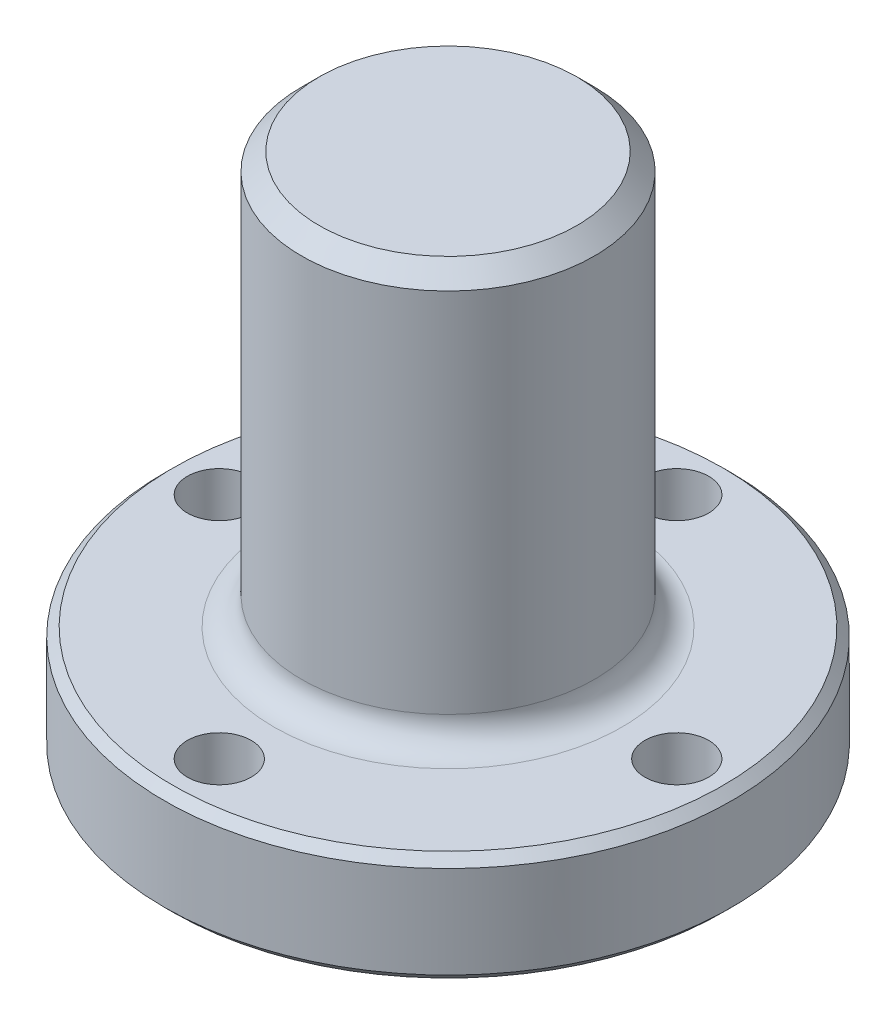
ISO-10303-21;
HEADER;
FILE_DESCRIPTION(('STEP AP214'),'2;1');
FILE_NAME('part.step','',(''),(''),'','','');
FILE_SCHEMA(('AUTOMOTIVE_DESIGN { 1 0 10303 214 1 1 1 1 }'));
ENDSEC;
DATA;
#1=APPLICATION_CONTEXT('core data for automotive mechanical design processes');
#2=APPLICATION_PROTOCOL_DEFINITION('international standard','automotive_design',2000,#1);
#3=PRODUCT_CONTEXT('',#1,'mechanical');
#4=PRODUCT('Part','Part','',(#3));
#5=PRODUCT_RELATED_PRODUCT_CATEGORY('part','',(#4));
#6=PRODUCT_DEFINITION_FORMATION('','',#4);
#7=PRODUCT_DEFINITION_CONTEXT('part definition',#1,'design');
#8=PRODUCT_DEFINITION('design','',#6,#7);
#9=PRODUCT_DEFINITION_SHAPE('','',#8);
#10=(LENGTH_UNIT() NAMED_UNIT(*) SI_UNIT(.MILLI.,.METRE.));
#11=(NAMED_UNIT(*) PLANE_ANGLE_UNIT() SI_UNIT($,.RADIAN.));
#12=(NAMED_UNIT(*) SI_UNIT($,.STERADIAN.) SOLID_ANGLE_UNIT());
#13=UNCERTAINTY_MEASURE_WITH_UNIT(LENGTH_MEASURE(1.E-05),#10,'distance_accuracy_value','');
#14=(GEOMETRIC_REPRESENTATION_CONTEXT(3) GLOBAL_UNCERTAINTY_ASSIGNED_CONTEXT((#13)) GLOBAL_UNIT_ASSIGNED_CONTEXT((#10,
#11,#12)) REPRESENTATION_CONTEXT('',''));
#15=CARTESIAN_POINT('',(0.,0.,0.));
#16=DIRECTION('',(0.,0.,1.));
#17=DIRECTION('',(1.,0.,0.));
#18=AXIS2_PLACEMENT_3D('',#15,#16,#17);
#19=CARTESIAN_POINT('',(0.,-25.0317,0.));
#20=DIRECTION('',(0.,1.,0.));
#21=DIRECTION('',(0.,0.,1.));
#22=AXIS2_PLACEMENT_3D('',#19,#20,#21);
#23=PLANE('',#22);
#24=CARTESIAN_POINT('',(0.,-25.0317,0.));
#25=DIRECTION('',(0.,-1.,0.));
#26=DIRECTION('',(0.,0.,-1.));
#27=AXIS2_PLACEMENT_3D('',#24,#25,#26);
#28=CIRCLE('',#27,8.7122);
#29=CARTESIAN_POINT('',(0.,-25.0317,-8.7122));
#30=VERTEX_POINT('',#29);
#31=EDGE_CURVE('E76',#30,#30,#28,.T.);
#32=ORIENTED_EDGE('',*,*,#31,.T.);
#33=EDGE_LOOP('',(#32));
#34=FACE_BOUND('',#33,.T.);
#35=ADVANCED_FACE('F43',(#34),#23,.F.);
#36=CARTESIAN_POINT('',(0.,-50.4317,0.));
#37=DIRECTION('',(0.,-1.,0.));
#38=DIRECTION('',(0.,0.,-1.));
#39=AXIS2_PLACEMENT_3D('',#36,#37,#38);
#40=CYLINDRICAL_SURFACE('',#39,8.7122);
#41=ORIENTED_EDGE('',*,*,#31,.F.);
#42=EDGE_LOOP('',(#41));
#43=FACE_BOUND('',#42,.T.);
#44=CARTESIAN_POINT('',(0.,-20.2057,0.));
#45=DIRECTION('',(0.,-1.,0.));
#46=DIRECTION('',(0.,0.,-1.));
#47=AXIS2_PLACEMENT_3D('',#44,#45,#46);
#48=CIRCLE('',#47,8.7122);
#49=CARTESIAN_POINT('',(0.,-20.2057,-8.7122));
#50=VERTEX_POINT('',#49);
#51=EDGE_CURVE('E79',#50,#50,#48,.T.);
#52=ORIENTED_EDGE('',*,*,#51,.T.);
#53=EDGE_LOOP('',(#52));
#54=FACE_BOUND('',#53,.T.);
#55=ADVANCED_FACE('F147',(#43,#54),#40,.T.);
#56=CARTESIAN_POINT('',(-8.7122,-20.2057,0.));
#57=DIRECTION('',(0.,1.,0.));
#58=DIRECTION('',(0.,0.,1.));
#59=AXIS2_PLACEMENT_3D('',#56,#57,#58);
#60=PLANE('',#59);
#61=CARTESIAN_POINT('',(0.,-20.2057,0.));
#62=DIRECTION('',(0.,1.,0.));
#63=DIRECTION('',(0.,0.,1.));
#64=AXIS2_PLACEMENT_3D('',#61,#62,#63);
#65=CIRCLE('',#64,23.8506);
#66=CARTESIAN_POINT('',(0.,-20.2057,23.8506));
#67=VERTEX_POINT('',#66);
#68=EDGE_CURVE('E55',#67,#67,#65,.F.);
#69=ORIENTED_EDGE('',*,*,#68,.T.);
#70=EDGE_LOOP('',(#69));
#71=FACE_BOUND('',#70,.T.);
#72=CARTESIAN_POINT('',(0.,-20.2057,19.8374));
#73=DIRECTION('',(0.,1.,0.));
#74=DIRECTION('',(0.,0.,1.));
#75=AXIS2_PLACEMENT_3D('',#72,#73,#74);
#76=CIRCLE('',#75,2.7686);
#77=CARTESIAN_POINT('',(0.,-20.2057,22.606));
#78=VERTEX_POINT('',#77);
#79=EDGE_CURVE('E86',#78,#78,#76,.T.);
#80=ORIENTED_EDGE('',*,*,#79,.T.);
#81=EDGE_LOOP('',(#80));
#82=FACE_BOUND('',#81,.T.);
#83=CARTESIAN_POINT('',(19.8374,-20.2057,0.));
#84=DIRECTION('',(0.,1.,0.));
#85=DIRECTION('',(0.,0.,1.));
#86=AXIS2_PLACEMENT_3D('',#83,#84,#85);
#87=CIRCLE('',#86,2.7686);
#88=CARTESIAN_POINT('',(19.8374,-20.2057,2.7686));
#89=VERTEX_POINT('',#88);
#90=EDGE_CURVE('E95',#89,#89,#87,.T.);
#91=ORIENTED_EDGE('',*,*,#90,.T.);
#92=EDGE_LOOP('',(#91));
#93=FACE_BOUND('',#92,.T.);
#94=CARTESIAN_POINT('',(0.,-20.2057,-19.8374));
#95=DIRECTION('',(0.,1.,0.));
#96=DIRECTION('',(0.,0.,1.));
#97=AXIS2_PLACEMENT_3D('',#94,#95,#96);
#98=CIRCLE('',#97,2.7686);
#99=CARTESIAN_POINT('',(0.,-20.2057,-17.0688));
#100=VERTEX_POINT('',#99);
#101=EDGE_CURVE('E89',#100,#100,#98,.T.);
#102=ORIENTED_EDGE('',*,*,#101,.T.);
#103=EDGE_LOOP('',(#102));
#104=FACE_BOUND('',#103,.T.);
#105=CARTESIAN_POINT('',(-19.8374,-20.2057,0.));
#106=DIRECTION('',(0.,1.,0.));
#107=DIRECTION('',(0.,0.,1.));
#108=AXIS2_PLACEMENT_3D('',#105,#106,#107);
#109=CIRCLE('',#108,2.7686);
#110=CARTESIAN_POINT('',(-19.8374,-20.2057,2.7686));
#111=VERTEX_POINT('',#110);
#112=EDGE_CURVE('E82',#111,#111,#109,.T.);
#113=ORIENTED_EDGE('',*,*,#112,.T.);
#114=EDGE_LOOP('',(#113));
#115=FACE_BOUND('',#114,.T.);
#116=ORIENTED_EDGE('',*,*,#51,.F.);
#117=EDGE_LOOP('',(#116));
#118=FACE_BOUND('',#117,.T.);
#119=ADVANCED_FACE('F107',(#71,#82,#93,#104,#115,#118),#60,.F.);
#120=CARTESIAN_POINT('',(0.,-50.4317,0.));
#121=DIRECTION('',(0.,-1.,0.));
#122=DIRECTION('',(0.,0.,-1.));
#123=AXIS2_PLACEMENT_3D('',#120,#121,#122);
#124=CYLINDRICAL_SURFACE('',#123,24.6126);
#125=CARTESIAN_POINT('',(0.,-11.4427,0.));
#126=DIRECTION('',(0.,-1.,0.));
#127=DIRECTION('',(0.,0.,-1.));
#128=AXIS2_PLACEMENT_3D('',#125,#126,#127);
#129=CIRCLE('',#128,24.6126);
#130=CARTESIAN_POINT('',(0.,-11.4427,-24.6126));
#131=VERTEX_POINT('',#130);
#132=EDGE_CURVE('E64',#131,#131,#129,.T.);
#133=ORIENTED_EDGE('',*,*,#132,.T.);
#134=EDGE_LOOP('',(#133));
#135=FACE_BOUND('',#134,.T.);
#136=CARTESIAN_POINT('',(0.,-19.4437,0.));
#137=DIRECTION('',(0.,1.,0.));
#138=DIRECTION('',(0.,0.,1.));
#139=AXIS2_PLACEMENT_3D('',#136,#137,#138);
#140=CIRCLE('',#139,24.6126);
#141=CARTESIAN_POINT('',(0.,-19.4437,24.6126));
#142=VERTEX_POINT('',#141);
#143=EDGE_CURVE('E67',#142,#142,#140,.T.);
#144=ORIENTED_EDGE('',*,*,#143,.T.);
#145=EDGE_LOOP('',(#144));
#146=FACE_BOUND('',#145,.T.);
#147=ADVANCED_FACE('F122',(#135,#146),#124,.T.);
#148=CARTESIAN_POINT('',(-24.6126,-10.6807,0.));
#149=DIRECTION('',(0.,-1.,0.));
#150=DIRECTION('',(0.,0.,-1.));
#151=AXIS2_PLACEMENT_3D('',#148,#149,#150);
#152=PLANE('',#151);
#153=CARTESIAN_POINT('',(0.,-10.6807,0.));
#154=DIRECTION('',(0.,-1.,0.));
#155=DIRECTION('',(0.,0.,-1.));
#156=AXIS2_PLACEMENT_3D('',#153,#154,#155);
#157=CIRCLE('',#156,23.8506);
#158=CARTESIAN_POINT('',(0.,-10.6807,-23.8506));
#159=VERTEX_POINT('',#158);
#160=EDGE_CURVE('E59',#159,#159,#157,.F.);
#161=ORIENTED_EDGE('',*,*,#160,.T.);
#162=EDGE_LOOP('',(#161));
#163=FACE_BOUND('',#162,.T.);
#164=CARTESIAN_POINT('',(0.,-10.6807,0.));
#165=DIRECTION('',(0.,-1.,0.));
#166=DIRECTION('',(0.,0.,-1.));
#167=AXIS2_PLACEMENT_3D('',#164,#165,#166);
#168=CIRCLE('',#167,15.0876);
#169=CARTESIAN_POINT('',(0.,-10.6807,-15.0876));
#170=VERTEX_POINT('',#169);
#171=EDGE_CURVE('E73',#170,#170,#168,.T.);
#172=ORIENTED_EDGE('',*,*,#171,.T.);
#173=EDGE_LOOP('',(#172));
#174=FACE_BOUND('',#173,.T.);
#175=CARTESIAN_POINT('',(0.,-10.6807,19.8374));
#176=DIRECTION('',(0.,-1.,0.));
#177=DIRECTION('',(0.,0.,-1.));
#178=AXIS2_PLACEMENT_3D('',#175,#176,#177);
#179=CIRCLE('',#178,2.7686);
#180=CARTESIAN_POINT('',(0.,-10.6807,17.0688));
#181=VERTEX_POINT('',#180);
#182=EDGE_CURVE('E101',#181,#181,#179,.T.);
#183=ORIENTED_EDGE('',*,*,#182,.T.);
#184=EDGE_LOOP('',(#183));
#185=FACE_BOUND('',#184,.T.);
#186=CARTESIAN_POINT('',(19.8374,-10.6807,0.));
#187=DIRECTION('',(0.,-1.,0.));
#188=DIRECTION('',(0.,0.,-1.));
#189=AXIS2_PLACEMENT_3D('',#186,#187,#188);
#190=CIRCLE('',#189,2.7686);
#191=CARTESIAN_POINT('',(19.8374,-10.6807,-2.7686));
#192=VERTEX_POINT('',#191);
#193=EDGE_CURVE('E98',#192,#192,#190,.T.);
#194=ORIENTED_EDGE('',*,*,#193,.T.);
#195=EDGE_LOOP('',(#194));
#196=FACE_BOUND('',#195,.T.);
#197=CARTESIAN_POINT('',(0.,-10.6807,-19.8374));
#198=DIRECTION('',(0.,-1.,0.));
#199=DIRECTION('',(0.,0.,-1.));
#200=AXIS2_PLACEMENT_3D('',#197,#198,#199);
#201=CIRCLE('',#200,2.7686);
#202=CARTESIAN_POINT('',(0.,-10.6807,-22.606));
#203=VERTEX_POINT('',#202);
#204=EDGE_CURVE('E92',#203,#203,#201,.T.);
#205=ORIENTED_EDGE('',*,*,#204,.T.);
#206=EDGE_LOOP('',(#205));
#207=FACE_BOUND('',#206,.T.);
#208=CARTESIAN_POINT('',(-19.8374,-10.6807,0.));
#209=DIRECTION('',(0.,-1.,0.));
#210=DIRECTION('',(0.,0.,-1.));
#211=AXIS2_PLACEMENT_3D('',#208,#209,#210);
#212=CIRCLE('',#211,2.7686);
#213=CARTESIAN_POINT('',(-19.8374,-10.6807,-2.7686));
#214=VERTEX_POINT('',#213);
#215=EDGE_CURVE('E83',#214,#214,#212,.T.);
#216=ORIENTED_EDGE('',*,*,#215,.T.);
#217=EDGE_LOOP('',(#216));
#218=FACE_BOUND('',#217,.T.);
#219=ADVANCED_FACE('F118',(#163,#174,#185,#196,#207,#218),#152,.F.);
#220=CARTESIAN_POINT('',(0.,-50.4317,0.));
#221=DIRECTION('',(0.,-1.,0.));
#222=DIRECTION('',(0.,0.,-1.));
#223=AXIS2_PLACEMENT_3D('',#220,#221,#222);
#224=CYLINDRICAL_SURFACE('',#223,12.7);
#225=CARTESIAN_POINT('',(0.,23.5077,0.));
#226=DIRECTION('',(0.,-1.,0.));
#227=DIRECTION('',(0.,0.,-1.));
#228=AXIS2_PLACEMENT_3D('',#225,#226,#227);
#229=CIRCLE('',#228,12.7);
#230=CARTESIAN_POINT('',(0.,23.5077,-12.7));
#231=VERTEX_POINT('',#230);
#232=EDGE_CURVE('E51',#231,#231,#229,.T.);
#233=ORIENTED_EDGE('',*,*,#232,.T.);
#234=EDGE_LOOP('',(#233));
#235=FACE_BOUND('',#234,.T.);
#236=CARTESIAN_POINT('',(0.,-8.2931,0.));
#237=DIRECTION('',(0.,-1.,0.));
#238=DIRECTION('',(0.,0.,-1.));
#239=AXIS2_PLACEMENT_3D('',#236,#237,#238);
#240=CIRCLE('',#239,12.7);
#241=CARTESIAN_POINT('',(0.,-8.2931,-12.7));
#242=VERTEX_POINT('',#241);
#243=EDGE_CURVE('E70',#242,#242,#240,.F.);
#244=ORIENTED_EDGE('',*,*,#243,.T.);
#245=EDGE_LOOP('',(#244));
#246=FACE_BOUND('',#245,.T.);
#247=ADVANCED_FACE('F121',(#235,#246),#224,.T.);
#248=CARTESIAN_POINT('',(-12.7,25.0317,0.));
#249=DIRECTION('',(0.,-1.,0.));
#250=DIRECTION('',(0.,0.,-1.));
#251=AXIS2_PLACEMENT_3D('',#248,#249,#250);
#252=PLANE('',#251);
#253=CARTESIAN_POINT('',(0.,25.0317,0.));
#254=DIRECTION('',(0.,-1.,0.));
#255=DIRECTION('',(0.,0.,-1.));
#256=AXIS2_PLACEMENT_3D('',#253,#254,#255);
#257=CIRCLE('',#256,11.176);
#258=CARTESIAN_POINT('',(0.,25.0317,-11.176));
#259=VERTEX_POINT('',#258);
#260=EDGE_CURVE('E10',#259,#259,#257,.F.);
#261=ORIENTED_EDGE('',*,*,#260,.T.);
#262=EDGE_LOOP('',(#261));
#263=FACE_BOUND('',#262,.T.);
#264=ADVANCED_FACE('F134',(#263),#252,.F.);
#265=CARTESIAN_POINT('',(-19.8374,25.0327,0.));
#266=DIRECTION('',(0.,-1.,0.));
#267=DIRECTION('',(0.,0.,-1.));
#268=AXIS2_PLACEMENT_3D('',#265,#266,#267);
#269=CYLINDRICAL_SURFACE('',#268,2.7686);
#270=ORIENTED_EDGE('',*,*,#112,.F.);
#271=EDGE_LOOP('',(#270));
#272=FACE_BOUND('',#271,.T.);
#273=ORIENTED_EDGE('',*,*,#215,.F.);
#274=EDGE_LOOP('',(#273));
#275=FACE_BOUND('',#274,.T.);
#276=ADVANCED_FACE('F131',(#272,#275),#269,.F.);
#277=CARTESIAN_POINT('',(0.,25.0327,-19.8374));
#278=DIRECTION('',(0.,-1.,0.));
#279=DIRECTION('',(0.,0.,-1.));
#280=AXIS2_PLACEMENT_3D('',#277,#278,#279);
#281=CYLINDRICAL_SURFACE('',#280,2.7686);
#282=ORIENTED_EDGE('',*,*,#101,.F.);
#283=EDGE_LOOP('',(#282));
#284=FACE_BOUND('',#283,.T.);
#285=ORIENTED_EDGE('',*,*,#204,.F.);
#286=EDGE_LOOP('',(#285));
#287=FACE_BOUND('',#286,.T.);
#288=ADVANCED_FACE('F133',(#284,#287),#281,.F.);
#289=CARTESIAN_POINT('',(19.8374,25.0327,0.));
#290=DIRECTION('',(0.,-1.,0.));
#291=DIRECTION('',(0.,0.,-1.));
#292=AXIS2_PLACEMENT_3D('',#289,#290,#291);
#293=CYLINDRICAL_SURFACE('',#292,2.7686);
#294=ORIENTED_EDGE('',*,*,#90,.F.);
#295=EDGE_LOOP('',(#294));
#296=FACE_BOUND('',#295,.T.);
#297=ORIENTED_EDGE('',*,*,#193,.F.);
#298=EDGE_LOOP('',(#297));
#299=FACE_BOUND('',#298,.T.);
#300=ADVANCED_FACE('F114',(#296,#299),#293,.F.);
#301=CARTESIAN_POINT('',(0.,25.0327,19.8374));
#302=DIRECTION('',(0.,-1.,0.));
#303=DIRECTION('',(0.,0.,-1.));
#304=AXIS2_PLACEMENT_3D('',#301,#302,#303);
#305=CYLINDRICAL_SURFACE('',#304,2.7686);
#306=ORIENTED_EDGE('',*,*,#79,.F.);
#307=EDGE_LOOP('',(#306));
#308=FACE_BOUND('',#307,.T.);
#309=ORIENTED_EDGE('',*,*,#182,.F.);
#310=EDGE_LOOP('',(#309));
#311=FACE_BOUND('',#310,.T.);
#312=ADVANCED_FACE('F110',(#308,#311),#305,.F.);
#313=CARTESIAN_POINT('',(0.,-8.2931,0.));
#314=DIRECTION('',(0.,-1.,0.));
#315=DIRECTION('',(0.,0.,-1.));
#316=AXIS2_PLACEMENT_3D('',#313,#314,#315);
#317=TOROIDAL_SURFACE('',#316,15.0876,2.3876);
#318=ORIENTED_EDGE('',*,*,#243,.F.);
#319=EDGE_LOOP('',(#318));
#320=FACE_BOUND('',#319,.T.);
#321=ORIENTED_EDGE('',*,*,#171,.F.);
#322=EDGE_LOOP('',(#321));
#323=FACE_BOUND('',#322,.T.);
#324=ADVANCED_FACE('F113',(#320,#323),#317,.F.);
#325=CARTESIAN_POINT('',(0.,-11.4427,0.));
#326=DIRECTION('',(0.,-1.,0.));
#327=DIRECTION('',(0.,0.,-1.));
#328=AXIS2_PLACEMENT_3D('',#325,#326,#327);
#329=CONICAL_SURFACE('',#328,24.6126,0.785398163397457);
#330=ORIENTED_EDGE('',*,*,#160,.F.);
#331=EDGE_LOOP('',(#330));
#332=FACE_BOUND('',#331,.T.);
#333=ORIENTED_EDGE('',*,*,#132,.F.);
#334=EDGE_LOOP('',(#333));
#335=FACE_BOUND('',#334,.T.);
#336=ADVANCED_FACE('F158',(#332,#335),#329,.T.);
#337=CARTESIAN_POINT('',(0.,-20.2057,0.));
#338=DIRECTION('',(0.,1.,0.));
#339=DIRECTION('',(0.,0.,1.));
#340=AXIS2_PLACEMENT_3D('',#337,#338,#339);
#341=CONICAL_SURFACE('',#340,23.8506,0.785398163397432);
#342=ORIENTED_EDGE('',*,*,#143,.F.);
#343=EDGE_LOOP('',(#342));
#344=FACE_BOUND('',#343,.T.);
#345=ORIENTED_EDGE('',*,*,#68,.F.);
#346=EDGE_LOOP('',(#345));
#347=FACE_BOUND('',#346,.T.);
#348=ADVANCED_FACE('F165',(#344,#347),#341,.T.);
#349=CARTESIAN_POINT('',(0.,23.5077,0.));
#350=DIRECTION('',(0.,-1.,0.));
#351=DIRECTION('',(0.,0.,-1.));
#352=AXIS2_PLACEMENT_3D('',#349,#350,#351);
#353=CONICAL_SURFACE('',#352,12.7,0.785398163397454);
#354=ORIENTED_EDGE('',*,*,#260,.F.);
#355=EDGE_LOOP('',(#354));
#356=FACE_BOUND('',#355,.T.);
#357=ORIENTED_EDGE('',*,*,#232,.F.);
#358=EDGE_LOOP('',(#357));
#359=FACE_BOUND('',#358,.T.);
#360=ADVANCED_FACE('F46',(#356,#359),#353,.T.);
#361=CLOSED_SHELL('',(#35,#55,#119,#147,#219,#247,#264,#276,#288,#300,#312,#324,#336,#348,#360));
#362=MANIFOLD_SOLID_BREP('B2',#361);
#363=ADVANCED_BREP_SHAPE_REPRESENTATION('',(#18,#362),#14);
#364=SHAPE_DEFINITION_REPRESENTATION(#9,#363);
ENDSEC;
END-ISO-10303-21;
